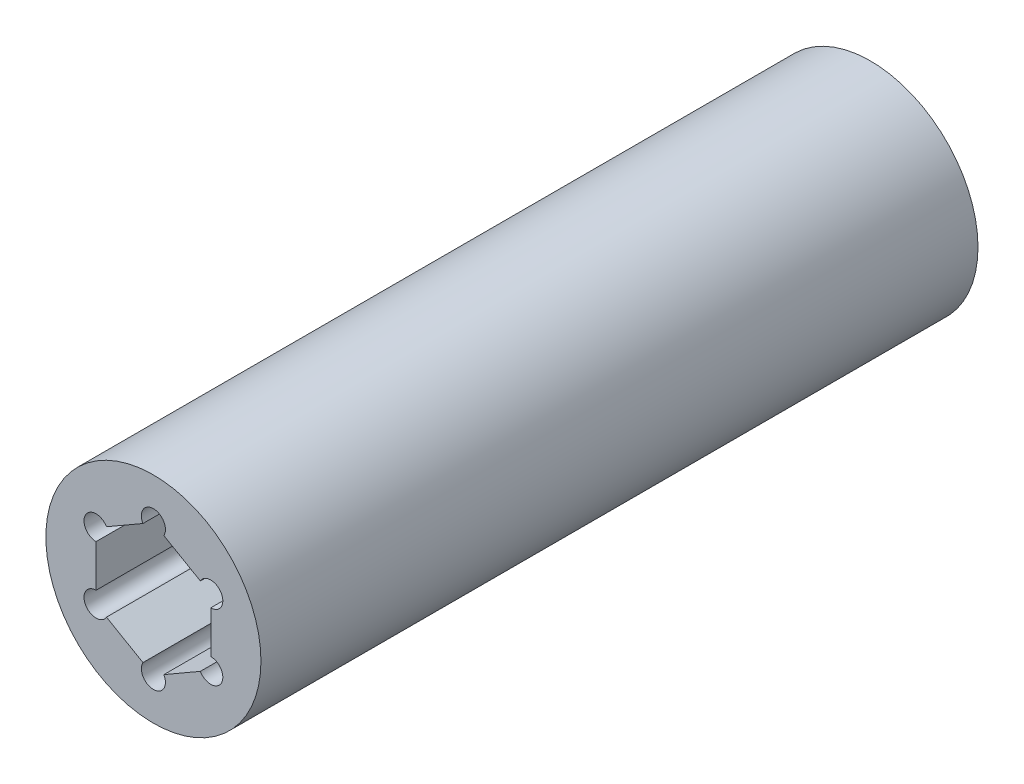
ISO-10303-21;
HEADER;
FILE_DESCRIPTION(('STEP AP214'),'2;1');
FILE_NAME('part.step','',(''),(''),'','','');
FILE_SCHEMA(('AUTOMOTIVE_DESIGN { 1 0 10303 214 1 1 1 1 }'));
ENDSEC;
DATA;
#1=APPLICATION_CONTEXT('core data for automotive mechanical design processes');
#2=APPLICATION_PROTOCOL_DEFINITION('international standard','automotive_design',2000,#1);
#3=PRODUCT_CONTEXT('',#1,'mechanical');
#4=PRODUCT('Part','Part','',(#3));
#5=PRODUCT_RELATED_PRODUCT_CATEGORY('part','',(#4));
#6=PRODUCT_DEFINITION_FORMATION('','',#4);
#7=PRODUCT_DEFINITION_CONTEXT('part definition',#1,'design');
#8=PRODUCT_DEFINITION('design','',#6,#7);
#9=PRODUCT_DEFINITION_SHAPE('','',#8);
#10=(LENGTH_UNIT() NAMED_UNIT(*) SI_UNIT(.MILLI.,.METRE.));
#11=(NAMED_UNIT(*) PLANE_ANGLE_UNIT() SI_UNIT($,.RADIAN.));
#12=(NAMED_UNIT(*) SI_UNIT($,.STERADIAN.) SOLID_ANGLE_UNIT());
#13=UNCERTAINTY_MEASURE_WITH_UNIT(LENGTH_MEASURE(1.E-05),#10,'distance_accuracy_value','');
#14=(GEOMETRIC_REPRESENTATION_CONTEXT(3) GLOBAL_UNCERTAINTY_ASSIGNED_CONTEXT((#13)) GLOBAL_UNIT_ASSIGNED_CONTEXT((#10,
#11,#12)) REPRESENTATION_CONTEXT('',''));
#15=CARTESIAN_POINT('',(0.,0.,0.));
#16=DIRECTION('',(0.,0.,1.));
#17=DIRECTION('',(1.,0.,0.));
#18=AXIS2_PLACEMENT_3D('',#15,#16,#17);
#19=CARTESIAN_POINT('',(-1.59999999999996,0.923760430703333,20.));
#20=DIRECTION('',(0.,0.,-1.));
#21=DIRECTION('',(-1.,0.,0.));
#22=AXIS2_PLACEMENT_3D('',#19,#20,#21);
#23=CYLINDRICAL_SURFACE('',#22,0.335912883892225);
#24=CARTESIAN_POINT('',(-1.59999999999996,0.923760430703333,0.));
#25=DIRECTION('',(0.,0.,1.));
#26=DIRECTION('',(1.,0.,0.));
#27=AXIS2_PLACEMENT_3D('',#24,#25,#26);
#28=CIRCLE('',#27,0.335912883892225);
#29=CARTESIAN_POINT('',(-1.30909090909084,1.09171687264951,0.));
#30=VERTEX_POINT('',#29);
#31=CARTESIAN_POINT('',(-1.6,0.587847546811107,0.));
#32=VERTEX_POINT('',#31);
#33=EDGE_CURVE('E172',#30,#32,#28,.T.);
#34=ORIENTED_EDGE('',*,*,#33,.F.);
#35=DIRECTION('',(0.,0.,-1.));
#36=VECTOR('',#35,1.);
#37=CARTESIAN_POINT('',(-1.30909090909084,1.09171687264951,20.));
#38=LINE('',#37,#36);
#39=CARTESIAN_POINT('',(-1.30909090909084,1.09171687264951,20.));
#40=VERTEX_POINT('',#39);
#41=EDGE_CURVE('E11',#40,#30,#38,.T.);
#42=ORIENTED_EDGE('',*,*,#41,.F.);
#43=CARTESIAN_POINT('',(-1.59999999999996,0.923760430703333,20.));
#44=DIRECTION('',(0.,0.,1.));
#45=DIRECTION('',(1.,0.,0.));
#46=AXIS2_PLACEMENT_3D('',#43,#44,#45);
#47=CIRCLE('',#46,0.335912883892225);
#48=CARTESIAN_POINT('',(-1.6,0.587847546811107,20.));
#49=VERTEX_POINT('',#48);
#50=EDGE_CURVE('E220',#40,#49,#47,.T.);
#51=ORIENTED_EDGE('',*,*,#50,.T.);
#52=DIRECTION('',(0.,0.,-1.));
#53=VECTOR('',#52,1.);
#54=CARTESIAN_POINT('',(-1.6,0.587847546811107,20.));
#55=LINE('',#54,#53);
#56=EDGE_CURVE('E62',#49,#32,#55,.T.);
#57=ORIENTED_EDGE('',*,*,#56,.T.);
#58=EDGE_LOOP('',(#34,#42,#51,#57));
#59=FACE_BOUND('',#58,.T.);
#60=ADVANCED_FACE('F45',(#59),#23,.F.);
#61=CARTESIAN_POINT('',(-0.800000000000002,1.3856406460551,20.));
#62=DIRECTION('',(0.500000000000001,-0.866025403784438,0.));
#63=DIRECTION('',(0.866025403784438,0.500000000000001,0.));
#64=AXIS2_PLACEMENT_3D('',#61,#62,#63);
#65=PLANE('',#64);
#66=DIRECTION('',(-0.866025403784438,-0.500000000000001,0.));
#67=VECTOR('',#66,1.);
#68=CARTESIAN_POINT('',(-0.800000000000002,1.3856406460551,0.));
#69=LINE('',#68,#67);
#70=CARTESIAN_POINT('',(-0.290909090909091,1.67956441946073,0.));
#71=VERTEX_POINT('',#70);
#72=EDGE_CURVE('E175',#71,#30,#69,.T.);
#73=ORIENTED_EDGE('',*,*,#72,.F.);
#74=DIRECTION('',(0.,0.,-1.));
#75=VECTOR('',#74,1.);
#76=CARTESIAN_POINT('',(-0.290909090909091,1.67956441946073,20.));
#77=LINE('',#76,#75);
#78=CARTESIAN_POINT('',(-0.290909090909091,1.67956441946073,20.));
#79=VERTEX_POINT('',#78);
#80=EDGE_CURVE('E54',#79,#71,#77,.T.);
#81=ORIENTED_EDGE('',*,*,#80,.F.);
#82=DIRECTION('',(-0.866025403784438,-0.500000000000001,0.));
#83=VECTOR('',#82,1.);
#84=CARTESIAN_POINT('',(-0.800000000000002,1.3856406460551,20.));
#85=LINE('',#84,#83);
#86=EDGE_CURVE('E268',#79,#40,#85,.T.);
#87=ORIENTED_EDGE('',*,*,#86,.T.);
#88=ORIENTED_EDGE('',*,*,#41,.T.);
#89=EDGE_LOOP('',(#73,#81,#87,#88));
#90=FACE_BOUND('',#89,.T.);
#91=ADVANCED_FACE('F255',(#90),#65,.T.);
#92=CARTESIAN_POINT('',(0.,1.8475208614068,20.));
#93=DIRECTION('',(0.,0.,-1.));
#94=DIRECTION('',(-1.,0.,0.));
#95=AXIS2_PLACEMENT_3D('',#92,#93,#94);
#96=CYLINDRICAL_SURFACE('',#95,0.335912883892146);
#97=CARTESIAN_POINT('',(0.,1.8475208614068,0.));
#98=DIRECTION('',(0.,0.,1.));
#99=DIRECTION('',(1.,0.,0.));
#100=AXIS2_PLACEMENT_3D('',#97,#98,#99);
#101=CIRCLE('',#100,0.335912883892146);
#102=CARTESIAN_POINT('',(0.290909090909092,1.67956441946073,0.));
#103=VERTEX_POINT('',#102);
#104=EDGE_CURVE('E179',#103,#71,#101,.T.);
#105=ORIENTED_EDGE('',*,*,#104,.F.);
#106=DIRECTION('',(0.,0.,-1.));
#107=VECTOR('',#106,1.);
#108=CARTESIAN_POINT('',(0.290909090909092,1.67956441946073,20.));
#109=LINE('',#108,#107);
#110=CARTESIAN_POINT('',(0.290909090909092,1.67956441946073,20.));
#111=VERTEX_POINT('',#110);
#112=EDGE_CURVE('E242',#111,#103,#109,.T.);
#113=ORIENTED_EDGE('',*,*,#112,.F.);
#114=CARTESIAN_POINT('',(0.,1.8475208614068,20.));
#115=DIRECTION('',(0.,0.,1.));
#116=DIRECTION('',(1.,0.,0.));
#117=AXIS2_PLACEMENT_3D('',#114,#115,#116);
#118=CIRCLE('',#117,0.335912883892146);
#119=EDGE_CURVE('E251',#111,#79,#118,.T.);
#120=ORIENTED_EDGE('',*,*,#119,.T.);
#121=ORIENTED_EDGE('',*,*,#80,.T.);
#122=EDGE_LOOP('',(#105,#113,#120,#121));
#123=FACE_BOUND('',#122,.T.);
#124=ADVANCED_FACE('F249',(#123),#96,.F.);
#125=CARTESIAN_POINT('',(0.799999999999996,1.38564064605511,20.));
#126=DIRECTION('',(-0.499999999999995,-0.866025403784442,0.));
#127=DIRECTION('',(0.866025403784442,-0.499999999999995,0.));
#128=AXIS2_PLACEMENT_3D('',#125,#126,#127);
#129=PLANE('',#128);
#130=DIRECTION('',(-0.866025403784442,0.499999999999995,0.));
#131=VECTOR('',#130,1.);
#132=CARTESIAN_POINT('',(0.799999999999996,1.38564064605511,0.));
#133=LINE('',#132,#131);
#134=CARTESIAN_POINT('',(1.30909090909089,1.09171687264949,0.));
#135=VERTEX_POINT('',#134);
#136=EDGE_CURVE('E183',#135,#103,#133,.T.);
#137=ORIENTED_EDGE('',*,*,#136,.F.);
#138=DIRECTION('',(0.,0.,-1.));
#139=VECTOR('',#138,1.);
#140=CARTESIAN_POINT('',(1.30909090909089,1.09171687264949,20.));
#141=LINE('',#140,#139);
#142=CARTESIAN_POINT('',(1.30909090909089,1.09171687264949,20.));
#143=VERTEX_POINT('',#142);
#144=EDGE_CURVE('E239',#143,#135,#141,.T.);
#145=ORIENTED_EDGE('',*,*,#144,.F.);
#146=DIRECTION('',(-0.866025403784442,0.499999999999995,0.));
#147=VECTOR('',#146,1.);
#148=CARTESIAN_POINT('',(0.799999999999996,1.38564064605511,20.));
#149=LINE('',#148,#147);
#150=EDGE_CURVE('E265',#143,#111,#149,.T.);
#151=ORIENTED_EDGE('',*,*,#150,.T.);
#152=ORIENTED_EDGE('',*,*,#112,.T.);
#153=EDGE_LOOP('',(#137,#145,#151,#152));
#154=FACE_BOUND('',#153,.T.);
#155=ADVANCED_FACE('F262',(#154),#129,.T.);
#156=CARTESIAN_POINT('',(1.60000000000004,0.92376043070347,20.));
#157=DIRECTION('',(0.,0.,-1.));
#158=DIRECTION('',(-1.,0.,0.));
#159=AXIS2_PLACEMENT_3D('',#156,#157,#158);
#160=CYLINDRICAL_SURFACE('',#159,0.335912883892169);
#161=CARTESIAN_POINT('',(1.60000000000004,0.92376043070347,0.));
#162=DIRECTION('',(0.,0.,1.));
#163=DIRECTION('',(1.,0.,0.));
#164=AXIS2_PLACEMENT_3D('',#161,#162,#163);
#165=CIRCLE('',#164,0.335912883892169);
#166=CARTESIAN_POINT('',(1.59999999999999,0.587847546811301,0.));
#167=VERTEX_POINT('',#166);
#168=EDGE_CURVE('E187',#167,#135,#165,.T.);
#169=ORIENTED_EDGE('',*,*,#168,.F.);
#170=DIRECTION('',(0.,0.,-1.));
#171=VECTOR('',#170,1.);
#172=CARTESIAN_POINT('',(1.59999999999999,0.587847546811301,20.));
#173=LINE('',#172,#171);
#174=CARTESIAN_POINT('',(1.59999999999999,0.587847546811301,20.));
#175=VERTEX_POINT('',#174);
#176=EDGE_CURVE('E236',#175,#167,#173,.T.);
#177=ORIENTED_EDGE('',*,*,#176,.F.);
#178=CARTESIAN_POINT('',(1.60000000000004,0.92376043070347,20.));
#179=DIRECTION('',(0.,0.,1.));
#180=DIRECTION('',(1.,0.,0.));
#181=AXIS2_PLACEMENT_3D('',#178,#179,#180);
#182=CIRCLE('',#181,0.335912883892169);
#183=EDGE_CURVE('E273',#175,#143,#182,.T.);
#184=ORIENTED_EDGE('',*,*,#183,.T.);
#185=ORIENTED_EDGE('',*,*,#144,.T.);
#186=EDGE_LOOP('',(#169,#177,#184,#185));
#187=FACE_BOUND('',#186,.T.);
#188=ADVANCED_FACE('F318',(#187),#160,.F.);
#189=CARTESIAN_POINT('',(1.6,0.,20.));
#190=DIRECTION('',(-1.,0.,0.));
#191=DIRECTION('',(0.,-1.,0.));
#192=AXIS2_PLACEMENT_3D('',#189,#190,#191);
#193=PLANE('',#192);
#194=DIRECTION('',(0.,1.,0.));
#195=VECTOR('',#194,1.);
#196=CARTESIAN_POINT('',(1.6,0.,0.));
#197=LINE('',#196,#195);
#198=CARTESIAN_POINT('',(1.60000000000001,-0.587847546811086,0.));
#199=VERTEX_POINT('',#198);
#200=EDGE_CURVE('E191',#199,#167,#197,.T.);
#201=ORIENTED_EDGE('',*,*,#200,.F.);
#202=DIRECTION('',(0.,0.,-1.));
#203=VECTOR('',#202,1.);
#204=CARTESIAN_POINT('',(1.60000000000001,-0.587847546811086,20.));
#205=LINE('',#204,#203);
#206=CARTESIAN_POINT('',(1.60000000000001,-0.587847546811086,20.));
#207=VERTEX_POINT('',#206);
#208=EDGE_CURVE('E233',#207,#199,#205,.T.);
#209=ORIENTED_EDGE('',*,*,#208,.F.);
#210=DIRECTION('',(0.,1.,0.));
#211=VECTOR('',#210,1.);
#212=CARTESIAN_POINT('',(1.6,0.,20.));
#213=LINE('',#212,#211);
#214=EDGE_CURVE('E280',#207,#175,#213,.T.);
#215=ORIENTED_EDGE('',*,*,#214,.T.);
#216=ORIENTED_EDGE('',*,*,#176,.T.);
#217=EDGE_LOOP('',(#201,#209,#215,#216));
#218=FACE_BOUND('',#217,.T.);
#219=ADVANCED_FACE('F321',(#218),#193,.T.);
#220=CARTESIAN_POINT('',(1.60000000000012,-0.923760430703333,20.));
#221=DIRECTION('',(0.,0.,-1.));
#222=DIRECTION('',(-1.,0.,0.));
#223=AXIS2_PLACEMENT_3D('',#220,#221,#222);
#224=CYLINDRICAL_SURFACE('',#223,0.335912883892248);
#225=CARTESIAN_POINT('',(1.60000000000012,-0.923760430703333,0.));
#226=DIRECTION('',(0.,0.,1.));
#227=DIRECTION('',(1.,0.,0.));
#228=AXIS2_PLACEMENT_3D('',#225,#226,#227);
#229=CIRCLE('',#228,0.335912883892248);
#230=CARTESIAN_POINT('',(1.30909090909094,-1.09171687264945,0.));
#231=VERTEX_POINT('',#230);
#232=EDGE_CURVE('E195',#231,#199,#229,.T.);
#233=ORIENTED_EDGE('',*,*,#232,.F.);
#234=DIRECTION('',(0.,0.,-1.));
#235=VECTOR('',#234,1.);
#236=CARTESIAN_POINT('',(1.30909090909094,-1.09171687264945,20.));
#237=LINE('',#236,#235);
#238=CARTESIAN_POINT('',(1.30909090909094,-1.09171687264945,20.));
#239=VERTEX_POINT('',#238);
#240=EDGE_CURVE('E230',#239,#231,#237,.T.);
#241=ORIENTED_EDGE('',*,*,#240,.F.);
#242=CARTESIAN_POINT('',(1.60000000000012,-0.923760430703333,20.));
#243=DIRECTION('',(0.,0.,1.));
#244=DIRECTION('',(1.,0.,0.));
#245=AXIS2_PLACEMENT_3D('',#242,#243,#244);
#246=CIRCLE('',#245,0.335912883892248);
#247=EDGE_CURVE('E284',#239,#207,#246,.T.);
#248=ORIENTED_EDGE('',*,*,#247,.T.);
#249=ORIENTED_EDGE('',*,*,#208,.T.);
#250=EDGE_LOOP('',(#233,#241,#248,#249));
#251=FACE_BOUND('',#250,.T.);
#252=ADVANCED_FACE('F325',(#251),#224,.F.);
#253=CARTESIAN_POINT('',(0.800000000000011,-1.3856406460551,20.));
#254=DIRECTION('',(-0.500000000000007,0.866025403784435,0.));
#255=DIRECTION('',(-0.866025403784435,-0.500000000000007,0.));
#256=AXIS2_PLACEMENT_3D('',#253,#254,#255);
#257=PLANE('',#256);
#258=DIRECTION('',(0.866025403784435,0.500000000000007,0.));
#259=VECTOR('',#258,1.);
#260=CARTESIAN_POINT('',(0.800000000000011,-1.3856406460551,0.));
#261=LINE('',#260,#259);
#262=CARTESIAN_POINT('',(0.290909090909352,-1.67956441946058,0.));
#263=VERTEX_POINT('',#262);
#264=EDGE_CURVE('E199',#263,#231,#261,.T.);
#265=ORIENTED_EDGE('',*,*,#264,.F.);
#266=DIRECTION('',(0.,0.,-1.));
#267=VECTOR('',#266,1.);
#268=CARTESIAN_POINT('',(0.290909090909352,-1.67956441946058,20.));
#269=LINE('',#268,#267);
#270=CARTESIAN_POINT('',(0.290909090909352,-1.67956441946058,20.));
#271=VERTEX_POINT('',#270);
#272=EDGE_CURVE('E227',#271,#263,#269,.T.);
#273=ORIENTED_EDGE('',*,*,#272,.F.);
#274=DIRECTION('',(0.866025403784435,0.500000000000007,0.));
#275=VECTOR('',#274,1.);
#276=CARTESIAN_POINT('',(0.800000000000011,-1.3856406460551,20.));
#277=LINE('',#276,#275);
#278=EDGE_CURVE('E288',#271,#239,#277,.T.);
#279=ORIENTED_EDGE('',*,*,#278,.T.);
#280=ORIENTED_EDGE('',*,*,#240,.T.);
#281=EDGE_LOOP('',(#265,#273,#279,#280));
#282=FACE_BOUND('',#281,.T.);
#283=ADVANCED_FACE('F329',(#282),#257,.T.);
#284=CARTESIAN_POINT('',(1.56633494681261E-13,-1.8475208614068,20.));
#285=DIRECTION('',(0.,0.,-1.));
#286=DIRECTION('',(-1.,0.,0.));
#287=AXIS2_PLACEMENT_3D('',#284,#285,#286);
#288=CYLINDRICAL_SURFACE('',#287,0.335912883892309);
#289=CARTESIAN_POINT('',(1.56633494681261E-13,-1.8475208614068,0.));
#290=DIRECTION('',(0.,0.,1.));
#291=DIRECTION('',(1.,0.,0.));
#292=AXIS2_PLACEMENT_3D('',#289,#290,#291);
#293=CIRCLE('',#292,0.335912883892309);
#294=CARTESIAN_POINT('',(-0.290909090909113,-1.67956441946071,0.));
#295=VERTEX_POINT('',#294);
#296=EDGE_CURVE('E203',#295,#263,#293,.T.);
#297=ORIENTED_EDGE('',*,*,#296,.F.);
#298=DIRECTION('',(0.,0.,-1.));
#299=VECTOR('',#298,1.);
#300=CARTESIAN_POINT('',(-0.290909090909113,-1.67956441946071,20.));
#301=LINE('',#300,#299);
#302=CARTESIAN_POINT('',(-0.290909090909113,-1.67956441946071,20.));
#303=VERTEX_POINT('',#302);
#304=EDGE_CURVE('E146',#303,#295,#301,.T.);
#305=ORIENTED_EDGE('',*,*,#304,.F.);
#306=CARTESIAN_POINT('',(1.56633494681261E-13,-1.8475208614068,20.));
#307=DIRECTION('',(0.,0.,1.));
#308=DIRECTION('',(1.,0.,0.));
#309=AXIS2_PLACEMENT_3D('',#306,#307,#308);
#310=CIRCLE('',#309,0.335912883892309);
#311=EDGE_CURVE('E157',#303,#271,#310,.T.);
#312=ORIENTED_EDGE('',*,*,#311,.T.);
#313=ORIENTED_EDGE('',*,*,#272,.T.);
#314=EDGE_LOOP('',(#297,#305,#312,#313));
#315=FACE_BOUND('',#314,.T.);
#316=ADVANCED_FACE('F294',(#315),#288,.F.);
#317=CARTESIAN_POINT('',(-0.799999999999992,-1.38564064605511,20.));
#318=DIRECTION('',(0.499999999999995,0.866025403784442,0.));
#319=DIRECTION('',(-0.866025403784442,0.499999999999995,0.));
#320=AXIS2_PLACEMENT_3D('',#317,#318,#319);
#321=PLANE('',#320);
#322=DIRECTION('',(0.866025403784442,-0.499999999999995,0.));
#323=VECTOR('',#322,1.);
#324=CARTESIAN_POINT('',(-0.799999999999992,-1.38564064605511,0.));
#325=LINE('',#324,#323);
#326=CARTESIAN_POINT('',(-1.30909090909066,-1.09171687264962,0.));
#327=VERTEX_POINT('',#326);
#328=EDGE_CURVE('E141',#327,#295,#325,.T.);
#329=ORIENTED_EDGE('',*,*,#328,.F.);
#330=DIRECTION('',(0.,0.,-1.));
#331=VECTOR('',#330,1.);
#332=CARTESIAN_POINT('',(-1.30909090909066,-1.09171687264962,20.));
#333=LINE('',#332,#331);
#334=CARTESIAN_POINT('',(-1.30909090909066,-1.09171687264962,20.));
#335=VERTEX_POINT('',#334);
#336=EDGE_CURVE('E136',#335,#327,#333,.T.);
#337=ORIENTED_EDGE('',*,*,#336,.F.);
#338=DIRECTION('',(0.866025403784442,-0.499999999999995,0.));
#339=VECTOR('',#338,1.);
#340=CARTESIAN_POINT('',(-0.799999999999992,-1.38564064605511,20.));
#341=LINE('',#340,#339);
#342=EDGE_CURVE('E139',#335,#303,#341,.T.);
#343=ORIENTED_EDGE('',*,*,#342,.T.);
#344=ORIENTED_EDGE('',*,*,#304,.T.);
#345=EDGE_LOOP('',(#329,#337,#343,#344));
#346=FACE_BOUND('',#345,.T.);
#347=ADVANCED_FACE('F138',(#346),#321,.T.);
#348=CARTESIAN_POINT('',(-1.59999999999988,-0.92376043070347,20.));
#349=DIRECTION('',(0.,0.,-1.));
#350=DIRECTION('',(-1.,0.,0.));
#351=AXIS2_PLACEMENT_3D('',#348,#349,#350);
#352=CYLINDRICAL_SURFACE('',#351,0.335912883892296);
#353=CARTESIAN_POINT('',(-1.59999999999988,-0.92376043070347,0.));
#354=DIRECTION('',(0.,0.,1.));
#355=DIRECTION('',(1.,0.,0.));
#356=AXIS2_PLACEMENT_3D('',#353,#354,#355);
#357=CIRCLE('',#356,0.335912883892296);
#358=CARTESIAN_POINT('',(-1.6,-0.587847546811174,0.));
#359=VERTEX_POINT('',#358);
#360=EDGE_CURVE('E209',#359,#327,#357,.T.);
#361=ORIENTED_EDGE('',*,*,#360,.F.);
#362=DIRECTION('',(0.,0.,-1.));
#363=VECTOR('',#362,1.);
#364=CARTESIAN_POINT('',(-1.6,-0.587847546811174,20.));
#365=LINE('',#364,#363);
#366=CARTESIAN_POINT('',(-1.6,-0.587847546811174,20.));
#367=VERTEX_POINT('',#366);
#368=EDGE_CURVE('E99',#367,#359,#365,.T.);
#369=ORIENTED_EDGE('',*,*,#368,.F.);
#370=CARTESIAN_POINT('',(-1.59999999999988,-0.92376043070347,20.));
#371=DIRECTION('',(0.,0.,1.));
#372=DIRECTION('',(1.,0.,0.));
#373=AXIS2_PLACEMENT_3D('',#370,#371,#372);
#374=CIRCLE('',#373,0.335912883892296);
#375=EDGE_CURVE('E154',#367,#335,#374,.T.);
#376=ORIENTED_EDGE('',*,*,#375,.T.);
#377=ORIENTED_EDGE('',*,*,#336,.T.);
#378=EDGE_LOOP('',(#361,#369,#376,#377));
#379=FACE_BOUND('',#378,.T.);
#380=ADVANCED_FACE('F160',(#379),#352,.F.);
#381=CARTESIAN_POINT('',(-1.6,0.,20.));
#382=DIRECTION('',(1.,0.,0.));
#383=DIRECTION('',(0.,1.,0.));
#384=AXIS2_PLACEMENT_3D('',#381,#382,#383);
#385=PLANE('',#384);
#386=DIRECTION('',(0.,-1.,0.));
#387=VECTOR('',#386,1.);
#388=CARTESIAN_POINT('',(-1.6,0.,0.));
#389=LINE('',#388,#387);
#390=EDGE_CURVE('E212',#32,#359,#389,.T.);
#391=ORIENTED_EDGE('',*,*,#390,.F.);
#392=ORIENTED_EDGE('',*,*,#56,.F.);
#393=DIRECTION('',(0.,-1.,0.));
#394=VECTOR('',#393,1.);
#395=CARTESIAN_POINT('',(-1.6,0.,20.));
#396=LINE('',#395,#394);
#397=EDGE_CURVE('E162',#49,#367,#396,.T.);
#398=ORIENTED_EDGE('',*,*,#397,.T.);
#399=ORIENTED_EDGE('',*,*,#368,.T.);
#400=EDGE_LOOP('',(#391,#392,#398,#399));
#401=FACE_BOUND('',#400,.T.);
#402=ADVANCED_FACE('F296',(#401),#385,.T.);
#403=CARTESIAN_POINT('',(0.,0.,20.));
#404=DIRECTION('',(0.,0.,-1.));
#405=DIRECTION('',(-1.,0.,0.));
#406=AXIS2_PLACEMENT_3D('',#403,#404,#405);
#407=CYLINDRICAL_SURFACE('',#406,3.);
#408=CARTESIAN_POINT('',(0.,0.,20.));
#409=DIRECTION('',(0.,0.,1.));
#410=DIRECTION('',(1.,0.,0.));
#411=AXIS2_PLACEMENT_3D('',#408,#409,#410);
#412=CIRCLE('',#411,3.);
#413=CARTESIAN_POINT('',(3.,0.,20.));
#414=VERTEX_POINT('',#413);
#415=EDGE_CURVE('E165',#414,#414,#412,.T.);
#416=ORIENTED_EDGE('',*,*,#415,.F.);
#417=EDGE_LOOP('',(#416));
#418=FACE_BOUND('',#417,.T.);
#419=CARTESIAN_POINT('',(0.,0.,0.));
#420=DIRECTION('',(0.,0.,1.));
#421=DIRECTION('',(1.,0.,0.));
#422=AXIS2_PLACEMENT_3D('',#419,#420,#421);
#423=CIRCLE('',#422,3.);
#424=CARTESIAN_POINT('',(3.,0.,0.));
#425=VERTEX_POINT('',#424);
#426=EDGE_CURVE('E216',#425,#425,#423,.T.);
#427=ORIENTED_EDGE('',*,*,#426,.T.);
#428=EDGE_LOOP('',(#427));
#429=FACE_BOUND('',#428,.T.);
#430=ADVANCED_FACE('F298',(#418,#429),#407,.T.);
#431=CARTESIAN_POINT('',(0.,0.,20.));
#432=DIRECTION('',(0.,0.,1.));
#433=DIRECTION('',(1.,0.,0.));
#434=AXIS2_PLACEMENT_3D('',#431,#432,#433);
#435=PLANE('',#434);
#436=ORIENTED_EDGE('',*,*,#50,.F.);
#437=ORIENTED_EDGE('',*,*,#86,.F.);
#438=ORIENTED_EDGE('',*,*,#119,.F.);
#439=ORIENTED_EDGE('',*,*,#150,.F.);
#440=ORIENTED_EDGE('',*,*,#183,.F.);
#441=ORIENTED_EDGE('',*,*,#214,.F.);
#442=ORIENTED_EDGE('',*,*,#247,.F.);
#443=ORIENTED_EDGE('',*,*,#278,.F.);
#444=ORIENTED_EDGE('',*,*,#311,.F.);
#445=ORIENTED_EDGE('',*,*,#342,.F.);
#446=ORIENTED_EDGE('',*,*,#375,.F.);
#447=ORIENTED_EDGE('',*,*,#397,.F.);
#448=EDGE_LOOP('',(#436,#437,#438,#439,#440,#441,#442,#443,#444,#445,#446,#447));
#449=FACE_BOUND('',#448,.T.);
#450=ORIENTED_EDGE('',*,*,#415,.T.);
#451=EDGE_LOOP('',(#450));
#452=FACE_BOUND('',#451,.T.);
#453=ADVANCED_FACE('F151',(#449,#452),#435,.T.);
#454=CARTESIAN_POINT('',(0.,0.,0.));
#455=DIRECTION('',(0.,0.,1.));
#456=DIRECTION('',(1.,0.,0.));
#457=AXIS2_PLACEMENT_3D('',#454,#455,#456);
#458=PLANE('',#457);
#459=ORIENTED_EDGE('',*,*,#33,.T.);
#460=ORIENTED_EDGE('',*,*,#390,.T.);
#461=ORIENTED_EDGE('',*,*,#360,.T.);
#462=ORIENTED_EDGE('',*,*,#328,.T.);
#463=ORIENTED_EDGE('',*,*,#296,.T.);
#464=ORIENTED_EDGE('',*,*,#264,.T.);
#465=ORIENTED_EDGE('',*,*,#232,.T.);
#466=ORIENTED_EDGE('',*,*,#200,.T.);
#467=ORIENTED_EDGE('',*,*,#168,.T.);
#468=ORIENTED_EDGE('',*,*,#136,.T.);
#469=ORIENTED_EDGE('',*,*,#104,.T.);
#470=ORIENTED_EDGE('',*,*,#72,.T.);
#471=EDGE_LOOP('',(#459,#460,#461,#462,#463,#464,#465,#466,#467,#468,#469,#470));
#472=FACE_BOUND('',#471,.T.);
#473=ORIENTED_EDGE('',*,*,#426,.F.);
#474=EDGE_LOOP('',(#473));
#475=FACE_BOUND('',#474,.T.);
#476=ADVANCED_FACE('F257',(#472,#475),#458,.F.);
#477=CLOSED_SHELL('',(#60,#91,#124,#155,#188,#219,#252,#283,#316,#347,#380,#402,#430,#453,#476));
#478=MANIFOLD_SOLID_BREP('B2',#477);
#479=ADVANCED_BREP_SHAPE_REPRESENTATION('',(#18,#478),#14);
#480=SHAPE_DEFINITION_REPRESENTATION(#9,#479);
ENDSEC;
END-ISO-10303-21;
